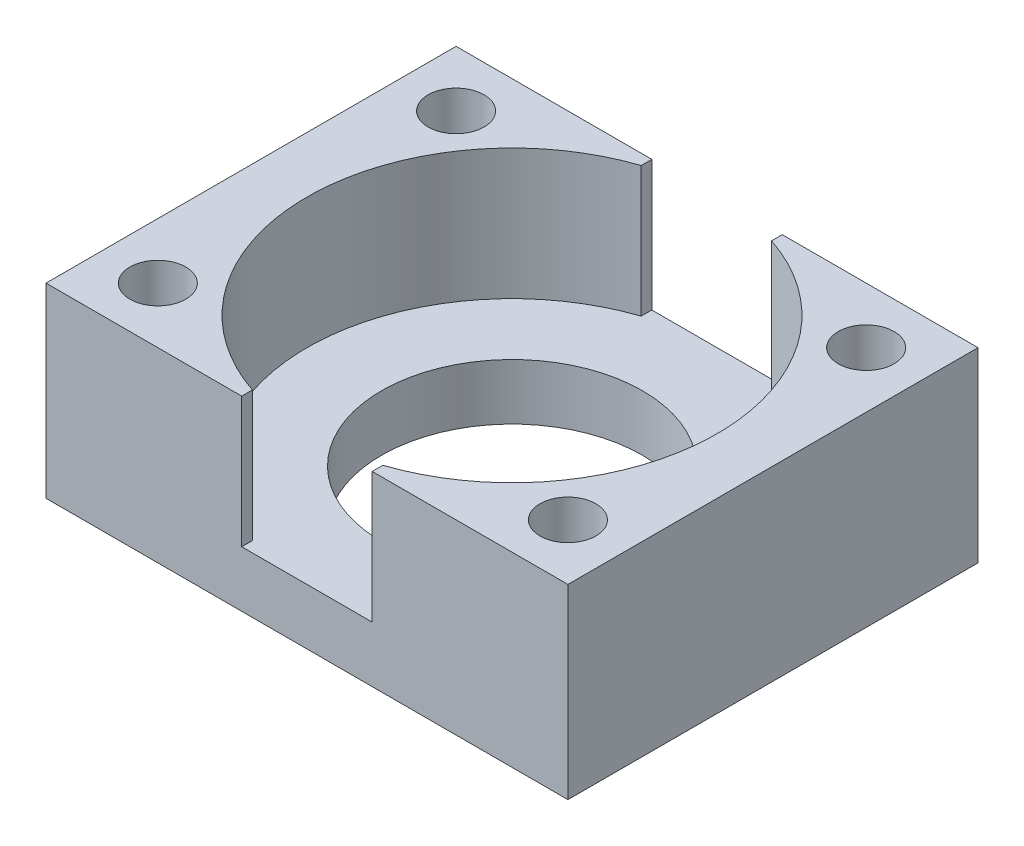
ISO-10303-21;
HEADER;
FILE_DESCRIPTION(('STEP AP214'),'2;1');
FILE_NAME('part.step','',(''),(''),'','','');
FILE_SCHEMA(('AUTOMOTIVE_DESIGN { 1 0 10303 214 1 1 1 1 }'));
ENDSEC;
DATA;
#1=APPLICATION_CONTEXT('core data for automotive mechanical design processes');
#2=APPLICATION_PROTOCOL_DEFINITION('international standard','automotive_design',2000,#1);
#3=PRODUCT_CONTEXT('',#1,'mechanical');
#4=PRODUCT('Part','Part','',(#3));
#5=PRODUCT_RELATED_PRODUCT_CATEGORY('part','',(#4));
#6=PRODUCT_DEFINITION_FORMATION('','',#4);
#7=PRODUCT_DEFINITION_CONTEXT('part definition',#1,'design');
#8=PRODUCT_DEFINITION('design','',#6,#7);
#9=PRODUCT_DEFINITION_SHAPE('','',#8);
#10=(LENGTH_UNIT() NAMED_UNIT(*) SI_UNIT(.MILLI.,.METRE.));
#11=(NAMED_UNIT(*) PLANE_ANGLE_UNIT() SI_UNIT($,.RADIAN.));
#12=(NAMED_UNIT(*) SI_UNIT($,.STERADIAN.) SOLID_ANGLE_UNIT());
#13=UNCERTAINTY_MEASURE_WITH_UNIT(LENGTH_MEASURE(1.E-05),#10,'distance_accuracy_value','');
#14=(GEOMETRIC_REPRESENTATION_CONTEXT(3) GLOBAL_UNCERTAINTY_ASSIGNED_CONTEXT((#13)) GLOBAL_UNIT_ASSIGNED_CONTEXT((#10,
#11,#12)) REPRESENTATION_CONTEXT('',''));
#15=CARTESIAN_POINT('',(0.,0.,0.));
#16=DIRECTION('',(0.,0.,1.));
#17=DIRECTION('',(1.,0.,0.));
#18=AXIS2_PLACEMENT_3D('',#15,#16,#17);
#19=CARTESIAN_POINT('',(-3.5,3.,11.));
#20=DIRECTION('',(-1.,0.,0.));
#21=DIRECTION('',(0.,-1.,0.));
#22=AXIS2_PLACEMENT_3D('',#19,#20,#21);
#23=PLANE('',#22);
#24=DIRECTION('',(0.,0.,-1.));
#25=VECTOR('',#24,1.);
#26=CARTESIAN_POINT('',(-3.5,3.,11.));
#27=LINE('',#26,#25);
#28=CARTESIAN_POINT('',(-3.5,3.,11.));
#29=VERTEX_POINT('',#28);
#30=CARTESIAN_POINT('',(-3.5,3.,10.4283268073071));
#31=VERTEX_POINT('',#30);
#32=EDGE_CURVE('E230',#29,#31,#27,.T.);
#33=ORIENTED_EDGE('',*,*,#32,.T.);
#34=DIRECTION('',(0.,1.,0.));
#35=VECTOR('',#34,1.);
#36=CARTESIAN_POINT('',(-3.5,3.,10.4283268073071));
#37=LINE('',#36,#35);
#38=CARTESIAN_POINT('',(-3.5,10.,10.4283268073071));
#39=VERTEX_POINT('',#38);
#40=EDGE_CURVE('E242',#31,#39,#37,.T.);
#41=ORIENTED_EDGE('',*,*,#40,.T.);
#42=DIRECTION('',(0.,0.,-1.));
#43=VECTOR('',#42,1.);
#44=CARTESIAN_POINT('',(-3.5,10.,11.));
#45=LINE('',#44,#43);
#46=CARTESIAN_POINT('',(-3.5,10.,11.));
#47=VERTEX_POINT('',#46);
#48=EDGE_CURVE('E173',#47,#39,#45,.T.);
#49=ORIENTED_EDGE('',*,*,#48,.F.);
#50=DIRECTION('',(0.,1.,0.));
#51=VECTOR('',#50,1.);
#52=CARTESIAN_POINT('',(-3.5,3.,11.));
#53=LINE('',#52,#51);
#54=EDGE_CURVE('E152',#29,#47,#53,.T.);
#55=ORIENTED_EDGE('',*,*,#54,.F.);
#56=EDGE_LOOP('',(#33,#41,#49,#55));
#57=FACE_BOUND('',#56,.T.);
#58=ADVANCED_FACE('F41',(#57),#23,.F.);
#59=CARTESIAN_POINT('',(3.5,3.,11.));
#60=DIRECTION('',(1.,0.,0.));
#61=DIRECTION('',(0.,1.,0.));
#62=AXIS2_PLACEMENT_3D('',#59,#60,#61);
#63=PLANE('',#62);
#64=DIRECTION('',(0.,0.,-1.));
#65=VECTOR('',#64,1.);
#66=CARTESIAN_POINT('',(3.5,3.,11.));
#67=LINE('',#66,#65);
#68=CARTESIAN_POINT('',(3.5,3.,-10.4283268073071));
#69=VERTEX_POINT('',#68);
#70=CARTESIAN_POINT('',(3.5,3.,-11.));
#71=VERTEX_POINT('',#70);
#72=EDGE_CURVE('E148',#69,#71,#67,.T.);
#73=ORIENTED_EDGE('',*,*,#72,.F.);
#74=DIRECTION('',(0.,1.,0.));
#75=VECTOR('',#74,1.);
#76=CARTESIAN_POINT('',(3.5,3.,-10.4283268073071));
#77=LINE('',#76,#75);
#78=CARTESIAN_POINT('',(3.5,10.,-10.4283268073071));
#79=VERTEX_POINT('',#78);
#80=EDGE_CURVE('E11',#69,#79,#77,.T.);
#81=ORIENTED_EDGE('',*,*,#80,.T.);
#82=DIRECTION('',(0.,0.,-1.));
#83=VECTOR('',#82,1.);
#84=CARTESIAN_POINT('',(3.5,10.,11.));
#85=LINE('',#84,#83);
#86=CARTESIAN_POINT('',(3.5,10.,-11.));
#87=VERTEX_POINT('',#86);
#88=EDGE_CURVE('E142',#79,#87,#85,.T.);
#89=ORIENTED_EDGE('',*,*,#88,.T.);
#90=DIRECTION('',(0.,-1.,0.));
#91=VECTOR('',#90,1.);
#92=CARTESIAN_POINT('',(3.5,3.,-11.));
#93=LINE('',#92,#91);
#94=EDGE_CURVE('E226',#87,#71,#93,.T.);
#95=ORIENTED_EDGE('',*,*,#94,.T.);
#96=EDGE_LOOP('',(#73,#81,#89,#95));
#97=FACE_BOUND('',#96,.T.);
#98=ADVANCED_FACE('F307',(#97),#63,.F.);
#99=CARTESIAN_POINT('',(0.,10.,0.));
#100=DIRECTION('',(0.,1.,0.));
#101=DIRECTION('',(0.,0.,1.));
#102=AXIS2_PLACEMENT_3D('',#99,#100,#101);
#103=PLANE('',#102);
#104=CARTESIAN_POINT('',(-11.,10.,-8.00000000000001));
#105=DIRECTION('',(0.,-1.,0.));
#106=DIRECTION('',(0.,0.,-1.));
#107=AXIS2_PLACEMENT_3D('',#104,#105,#106);
#108=CIRCLE('',#107,1.49999999999999);
#109=CARTESIAN_POINT('',(-11.,10.,-9.5));
#110=VERTEX_POINT('',#109);
#111=EDGE_CURVE('E262',#110,#110,#108,.T.);
#112=ORIENTED_EDGE('',*,*,#111,.T.);
#113=EDGE_LOOP('',(#112));
#114=FACE_BOUND('',#113,.T.);
#115=CARTESIAN_POINT('',(-11.,10.,7.99999999999999));
#116=DIRECTION('',(0.,-1.,0.));
#117=DIRECTION('',(0.,0.,1.));
#118=AXIS2_PLACEMENT_3D('',#115,#116,#117);
#119=CIRCLE('',#118,1.5);
#120=CARTESIAN_POINT('',(-11.,10.,9.49999999999999));
#121=VERTEX_POINT('',#120);
#122=EDGE_CURVE('E274',#121,#121,#119,.T.);
#123=ORIENTED_EDGE('',*,*,#122,.T.);
#124=EDGE_LOOP('',(#123));
#125=FACE_BOUND('',#124,.T.);
#126=CARTESIAN_POINT('',(0.,10.,0.));
#127=DIRECTION('',(0.,1.,0.));
#128=DIRECTION('',(0.,0.,1.));
#129=AXIS2_PLACEMENT_3D('',#126,#127,#128);
#130=CIRCLE('',#129,11.);
#131=CARTESIAN_POINT('',(-3.5,10.,-10.4283268073071));
#132=VERTEX_POINT('',#131);
#133=EDGE_CURVE('E143',#132,#39,#130,.T.);
#134=ORIENTED_EDGE('',*,*,#133,.F.);
#135=CARTESIAN_POINT('',(-3.5,10.,-11.));
#136=VERTEX_POINT('',#135);
#137=EDGE_CURVE('E215',#132,#136,#45,.T.);
#138=ORIENTED_EDGE('',*,*,#137,.T.);
#139=DIRECTION('',(-1.,0.,0.));
#140=VECTOR('',#139,1.);
#141=CARTESIAN_POINT('',(-14.,10.,-11.));
#142=LINE('',#141,#140);
#143=CARTESIAN_POINT('',(-14.,10.,-11.));
#144=VERTEX_POINT('',#143);
#145=EDGE_CURVE('E158',#136,#144,#142,.T.);
#146=ORIENTED_EDGE('',*,*,#145,.T.);
#147=DIRECTION('',(0.,0.,1.));
#148=VECTOR('',#147,1.);
#149=CARTESIAN_POINT('',(-14.,10.,-11.));
#150=LINE('',#149,#148);
#151=CARTESIAN_POINT('',(-14.,10.,11.));
#152=VERTEX_POINT('',#151);
#153=EDGE_CURVE('E162',#144,#152,#150,.T.);
#154=ORIENTED_EDGE('',*,*,#153,.T.);
#155=DIRECTION('',(1.,0.,0.));
#156=VECTOR('',#155,1.);
#157=CARTESIAN_POINT('',(-14.,10.,11.));
#158=LINE('',#157,#156);
#159=EDGE_CURVE('E165',#152,#47,#158,.T.);
#160=ORIENTED_EDGE('',*,*,#159,.T.);
#161=ORIENTED_EDGE('',*,*,#48,.T.);
#162=EDGE_LOOP('',(#134,#138,#146,#154,#160,#161));
#163=FACE_BOUND('',#162,.T.);
#164=ADVANCED_FACE('F213',(#114,#125,#163),#103,.T.);
#165=CARTESIAN_POINT('',(14.,10.,-11.));
#166=DIRECTION('',(-1.,0.,0.));
#167=DIRECTION('',(0.,0.,1.));
#168=AXIS2_PLACEMENT_3D('',#165,#166,#167);
#169=PLANE('',#168);
#170=DIRECTION('',(0.,0.,-1.));
#171=VECTOR('',#170,1.);
#172=CARTESIAN_POINT('',(14.,0.,-11.));
#173=LINE('',#172,#171);
#174=CARTESIAN_POINT('',(14.,0.,11.));
#175=VERTEX_POINT('',#174);
#176=CARTESIAN_POINT('',(14.,0.,-11.));
#177=VERTEX_POINT('',#176);
#178=EDGE_CURVE('E169',#175,#177,#173,.T.);
#179=ORIENTED_EDGE('',*,*,#178,.T.);
#180=DIRECTION('',(0.,-1.,0.));
#181=VECTOR('',#180,1.);
#182=CARTESIAN_POINT('',(14.,10.,-11.));
#183=LINE('',#182,#181);
#184=CARTESIAN_POINT('',(14.,10.,-11.));
#185=VERTEX_POINT('',#184);
#186=EDGE_CURVE('E134',#185,#177,#183,.T.);
#187=ORIENTED_EDGE('',*,*,#186,.F.);
#188=DIRECTION('',(0.,0.,-1.));
#189=VECTOR('',#188,1.);
#190=CARTESIAN_POINT('',(14.,10.,-11.));
#191=LINE('',#190,#189);
#192=CARTESIAN_POINT('',(14.,10.,11.));
#193=VERTEX_POINT('',#192);
#194=EDGE_CURVE('E155',#193,#185,#191,.T.);
#195=ORIENTED_EDGE('',*,*,#194,.F.);
#196=DIRECTION('',(0.,-1.,0.));
#197=VECTOR('',#196,1.);
#198=CARTESIAN_POINT('',(14.,10.,11.));
#199=LINE('',#198,#197);
#200=EDGE_CURVE('E168',#193,#175,#199,.T.);
#201=ORIENTED_EDGE('',*,*,#200,.T.);
#202=EDGE_LOOP('',(#179,#187,#195,#201));
#203=FACE_BOUND('',#202,.T.);
#204=ADVANCED_FACE('F43',(#203),#169,.F.);
#205=CARTESIAN_POINT('',(-14.,10.,-11.));
#206=DIRECTION('',(0.,0.,1.));
#207=DIRECTION('',(1.,0.,0.));
#208=AXIS2_PLACEMENT_3D('',#205,#206,#207);
#209=PLANE('',#208);
#210=ORIENTED_EDGE('',*,*,#145,.F.);
#211=DIRECTION('',(0.,1.,0.));
#212=VECTOR('',#211,1.);
#213=CARTESIAN_POINT('',(-3.5,3.,-11.));
#214=LINE('',#213,#212);
#215=CARTESIAN_POINT('',(-3.5,3.,-11.));
#216=VERTEX_POINT('',#215);
#217=EDGE_CURVE('E219',#216,#136,#214,.T.);
#218=ORIENTED_EDGE('',*,*,#217,.F.);
#219=DIRECTION('',(-1.,0.,0.));
#220=VECTOR('',#219,1.);
#221=CARTESIAN_POINT('',(3.5,3.,-11.));
#222=LINE('',#221,#220);
#223=EDGE_CURVE('E220',#71,#216,#222,.T.);
#224=ORIENTED_EDGE('',*,*,#223,.F.);
#225=ORIENTED_EDGE('',*,*,#94,.F.);
#226=EDGE_CURVE('E160',#185,#87,#142,.T.);
#227=ORIENTED_EDGE('',*,*,#226,.F.);
#228=ORIENTED_EDGE('',*,*,#186,.T.);
#229=DIRECTION('',(-1.,0.,0.));
#230=VECTOR('',#229,1.);
#231=CARTESIAN_POINT('',(-14.,0.,-11.));
#232=LINE('',#231,#230);
#233=CARTESIAN_POINT('',(-14.,0.,-11.));
#234=VERTEX_POINT('',#233);
#235=EDGE_CURVE('E172',#177,#234,#232,.T.);
#236=ORIENTED_EDGE('',*,*,#235,.T.);
#237=DIRECTION('',(0.,-1.,0.));
#238=VECTOR('',#237,1.);
#239=CARTESIAN_POINT('',(-14.,10.,-11.));
#240=LINE('',#239,#238);
#241=EDGE_CURVE('E183',#144,#234,#240,.T.);
#242=ORIENTED_EDGE('',*,*,#241,.F.);
#243=EDGE_LOOP('',(#210,#218,#224,#225,#227,#228,#236,#242));
#244=FACE_BOUND('',#243,.T.);
#245=ADVANCED_FACE('F190',(#244),#209,.F.);
#246=CARTESIAN_POINT('',(-14.,10.,-11.));
#247=DIRECTION('',(1.,0.,0.));
#248=DIRECTION('',(0.,0.,-1.));
#249=AXIS2_PLACEMENT_3D('',#246,#247,#248);
#250=PLANE('',#249);
#251=DIRECTION('',(0.,0.,1.));
#252=VECTOR('',#251,1.);
#253=CARTESIAN_POINT('',(-14.,0.,-11.));
#254=LINE('',#253,#252);
#255=CARTESIAN_POINT('',(-14.,0.,11.));
#256=VERTEX_POINT('',#255);
#257=EDGE_CURVE('E175',#234,#256,#254,.T.);
#258=ORIENTED_EDGE('',*,*,#257,.T.);
#259=DIRECTION('',(0.,-1.,0.));
#260=VECTOR('',#259,1.);
#261=CARTESIAN_POINT('',(-14.,10.,11.));
#262=LINE('',#261,#260);
#263=EDGE_CURVE('E180',#152,#256,#262,.T.);
#264=ORIENTED_EDGE('',*,*,#263,.F.);
#265=ORIENTED_EDGE('',*,*,#153,.F.);
#266=ORIENTED_EDGE('',*,*,#241,.T.);
#267=EDGE_LOOP('',(#258,#264,#265,#266));
#268=FACE_BOUND('',#267,.T.);
#269=ADVANCED_FACE('F203',(#268),#250,.F.);
#270=CARTESIAN_POINT('',(-14.,10.,11.));
#271=DIRECTION('',(0.,0.,-1.));
#272=DIRECTION('',(-1.,0.,0.));
#273=AXIS2_PLACEMENT_3D('',#270,#271,#272);
#274=PLANE('',#273);
#275=DIRECTION('',(-1.,0.,0.));
#276=VECTOR('',#275,1.);
#277=CARTESIAN_POINT('',(3.5,3.,11.));
#278=LINE('',#277,#276);
#279=CARTESIAN_POINT('',(3.5,3.,11.));
#280=VERTEX_POINT('',#279);
#281=EDGE_CURVE('E224',#280,#29,#278,.T.);
#282=ORIENTED_EDGE('',*,*,#281,.T.);
#283=ORIENTED_EDGE('',*,*,#54,.T.);
#284=ORIENTED_EDGE('',*,*,#159,.F.);
#285=ORIENTED_EDGE('',*,*,#263,.T.);
#286=DIRECTION('',(1.,0.,0.));
#287=VECTOR('',#286,1.);
#288=CARTESIAN_POINT('',(-14.,0.,11.));
#289=LINE('',#288,#287);
#290=EDGE_CURVE('E159',#256,#175,#289,.T.);
#291=ORIENTED_EDGE('',*,*,#290,.T.);
#292=ORIENTED_EDGE('',*,*,#200,.F.);
#293=CARTESIAN_POINT('',(3.5,10.,11.));
#294=VERTEX_POINT('',#293);
#295=EDGE_CURVE('E164',#294,#193,#158,.T.);
#296=ORIENTED_EDGE('',*,*,#295,.F.);
#297=DIRECTION('',(0.,-1.,0.));
#298=VECTOR('',#297,1.);
#299=CARTESIAN_POINT('',(3.5,3.,11.));
#300=LINE('',#299,#298);
#301=EDGE_CURVE('E147',#294,#280,#300,.T.);
#302=ORIENTED_EDGE('',*,*,#301,.T.);
#303=EDGE_LOOP('',(#282,#283,#284,#285,#291,#292,#296,#302));
#304=FACE_BOUND('',#303,.T.);
#305=ADVANCED_FACE('F207',(#304),#274,.F.);
#306=CARTESIAN_POINT('',(11.,10.,8.));
#307=DIRECTION('',(0.,-1.,0.));
#308=DIRECTION('',(0.,0.,-1.));
#309=AXIS2_PLACEMENT_3D('',#306,#307,#308);
#310=CIRCLE('',#309,1.5);
#311=CARTESIAN_POINT('',(11.,10.,6.5));
#312=VERTEX_POINT('',#311);
#313=EDGE_CURVE('E269',#312,#312,#310,.T.);
#314=ORIENTED_EDGE('',*,*,#313,.T.);
#315=EDGE_LOOP('',(#314));
#316=FACE_BOUND('',#315,.T.);
#317=CARTESIAN_POINT('',(11.,10.,-8.));
#318=DIRECTION('',(0.,-1.,0.));
#319=DIRECTION('',(0.,0.,1.));
#320=AXIS2_PLACEMENT_3D('',#317,#318,#319);
#321=CIRCLE('',#320,1.5);
#322=CARTESIAN_POINT('',(11.,10.,-6.5));
#323=VERTEX_POINT('',#322);
#324=EDGE_CURVE('E253',#323,#323,#321,.T.);
#325=ORIENTED_EDGE('',*,*,#324,.T.);
#326=EDGE_LOOP('',(#325));
#327=FACE_BOUND('',#326,.T.);
#328=CARTESIAN_POINT('',(3.5,10.,10.4283268073071));
#329=VERTEX_POINT('',#328);
#330=EDGE_CURVE('E131',#329,#79,#130,.T.);
#331=ORIENTED_EDGE('',*,*,#330,.F.);
#332=EDGE_CURVE('E139',#294,#329,#85,.T.);
#333=ORIENTED_EDGE('',*,*,#332,.F.);
#334=ORIENTED_EDGE('',*,*,#295,.T.);
#335=ORIENTED_EDGE('',*,*,#194,.T.);
#336=ORIENTED_EDGE('',*,*,#226,.T.);
#337=ORIENTED_EDGE('',*,*,#88,.F.);
#338=EDGE_LOOP('',(#331,#333,#334,#335,#336,#337));
#339=FACE_BOUND('',#338,.T.);
#340=ADVANCED_FACE('F138',(#316,#327,#339),#103,.T.);
#341=CARTESIAN_POINT('',(0.,0.,0.));
#342=DIRECTION('',(0.,1.,0.));
#343=DIRECTION('',(0.,0.,1.));
#344=AXIS2_PLACEMENT_3D('',#341,#342,#343);
#345=PLANE('',#344);
#346=CARTESIAN_POINT('',(11.,0.,8.));
#347=DIRECTION('',(0.,-1.,0.));
#348=DIRECTION('',(0.,0.,-1.));
#349=AXIS2_PLACEMENT_3D('',#346,#347,#348);
#350=CIRCLE('',#349,1.5);
#351=CARTESIAN_POINT('',(11.,0.,6.5));
#352=VERTEX_POINT('',#351);
#353=EDGE_CURVE('E259',#352,#352,#350,.T.);
#354=ORIENTED_EDGE('',*,*,#353,.F.);
#355=EDGE_LOOP('',(#354));
#356=FACE_BOUND('',#355,.T.);
#357=CARTESIAN_POINT('',(-11.,0.,-8.00000000000001));
#358=DIRECTION('',(0.,-1.,0.));
#359=DIRECTION('',(0.,0.,-1.));
#360=AXIS2_PLACEMENT_3D('',#357,#358,#359);
#361=CIRCLE('',#360,1.49999999999999);
#362=CARTESIAN_POINT('',(-11.,0.,-9.5));
#363=VERTEX_POINT('',#362);
#364=EDGE_CURVE('E265',#363,#363,#361,.T.);
#365=ORIENTED_EDGE('',*,*,#364,.F.);
#366=EDGE_LOOP('',(#365));
#367=FACE_BOUND('',#366,.T.);
#368=CARTESIAN_POINT('',(-11.,0.,7.99999999999999));
#369=DIRECTION('',(0.,-1.,0.));
#370=DIRECTION('',(0.,0.,1.));
#371=AXIS2_PLACEMENT_3D('',#368,#369,#370);
#372=CIRCLE('',#371,1.5);
#373=CARTESIAN_POINT('',(-11.,0.,9.49999999999999));
#374=VERTEX_POINT('',#373);
#375=EDGE_CURVE('E266',#374,#374,#372,.T.);
#376=ORIENTED_EDGE('',*,*,#375,.F.);
#377=EDGE_LOOP('',(#376));
#378=FACE_BOUND('',#377,.T.);
#379=CARTESIAN_POINT('',(11.,0.,-8.));
#380=DIRECTION('',(0.,-1.,0.));
#381=DIRECTION('',(0.,0.,1.));
#382=AXIS2_PLACEMENT_3D('',#379,#380,#381);
#383=CIRCLE('',#382,1.5);
#384=CARTESIAN_POINT('',(11.,0.,-6.5));
#385=VERTEX_POINT('',#384);
#386=EDGE_CURVE('E256',#385,#385,#383,.T.);
#387=ORIENTED_EDGE('',*,*,#386,.F.);
#388=EDGE_LOOP('',(#387));
#389=FACE_BOUND('',#388,.T.);
#390=CARTESIAN_POINT('',(0.,0.,0.));
#391=DIRECTION('',(0.,-1.,0.));
#392=DIRECTION('',(0.,0.,-1.));
#393=AXIS2_PLACEMENT_3D('',#390,#391,#392);
#394=CIRCLE('',#393,7.);
#395=CARTESIAN_POINT('',(0.,0.,-7.));
#396=VERTEX_POINT('',#395);
#397=EDGE_CURVE('E249',#396,#396,#394,.T.);
#398=ORIENTED_EDGE('',*,*,#397,.F.);
#399=EDGE_LOOP('',(#398));
#400=FACE_BOUND('',#399,.T.);
#401=ORIENTED_EDGE('',*,*,#178,.F.);
#402=ORIENTED_EDGE('',*,*,#290,.F.);
#403=ORIENTED_EDGE('',*,*,#257,.F.);
#404=ORIENTED_EDGE('',*,*,#235,.F.);
#405=EDGE_LOOP('',(#401,#402,#403,#404));
#406=FACE_BOUND('',#405,.T.);
#407=ADVANCED_FACE('F199',(#356,#367,#378,#389,#400,#406),#345,.F.);
#408=ORIENTED_EDGE('',*,*,#137,.F.);
#409=DIRECTION('',(0.,1.,0.));
#410=VECTOR('',#409,1.);
#411=CARTESIAN_POINT('',(-3.5,3.,-10.4283268073071));
#412=LINE('',#411,#410);
#413=CARTESIAN_POINT('',(-3.5,3.,-10.4283268073071));
#414=VERTEX_POINT('',#413);
#415=EDGE_CURVE('E245',#132,#414,#412,.F.);
#416=ORIENTED_EDGE('',*,*,#415,.T.);
#417=EDGE_CURVE('E232',#414,#216,#27,.T.);
#418=ORIENTED_EDGE('',*,*,#417,.T.);
#419=ORIENTED_EDGE('',*,*,#217,.T.);
#420=EDGE_LOOP('',(#408,#416,#418,#419));
#421=FACE_BOUND('',#420,.T.);
#422=ADVANCED_FACE('F284',(#421),#23,.F.);
#423=CARTESIAN_POINT('',(3.5,3.,11.));
#424=DIRECTION('',(0.,-1.,0.));
#425=DIRECTION('',(0.,0.,-1.));
#426=AXIS2_PLACEMENT_3D('',#423,#424,#425);
#427=PLANE('',#426);
#428=CARTESIAN_POINT('',(0.,3.,0.));
#429=DIRECTION('',(0.,-1.,0.));
#430=DIRECTION('',(0.,0.,-1.));
#431=AXIS2_PLACEMENT_3D('',#428,#429,#430);
#432=CIRCLE('',#431,7.);
#433=CARTESIAN_POINT('',(0.,3.,-7.));
#434=VERTEX_POINT('',#433);
#435=EDGE_CURVE('E252',#434,#434,#432,.T.);
#436=ORIENTED_EDGE('',*,*,#435,.T.);
#437=EDGE_LOOP('',(#436));
#438=FACE_BOUND('',#437,.T.);
#439=ORIENTED_EDGE('',*,*,#417,.F.);
#440=CARTESIAN_POINT('',(0.,3.,0.));
#441=DIRECTION('',(0.,1.,0.));
#442=DIRECTION('',(0.,0.,1.));
#443=AXIS2_PLACEMENT_3D('',#440,#441,#442);
#444=CIRCLE('',#443,11.);
#445=EDGE_CURVE('E56',#414,#31,#444,.T.);
#446=ORIENTED_EDGE('',*,*,#445,.T.);
#447=ORIENTED_EDGE('',*,*,#32,.F.);
#448=ORIENTED_EDGE('',*,*,#281,.F.);
#449=CARTESIAN_POINT('',(3.5,3.,10.4283268073071));
#450=VERTEX_POINT('',#449);
#451=EDGE_CURVE('E150',#280,#450,#67,.T.);
#452=ORIENTED_EDGE('',*,*,#451,.T.);
#453=EDGE_CURVE('E63',#450,#69,#444,.T.);
#454=ORIENTED_EDGE('',*,*,#453,.T.);
#455=ORIENTED_EDGE('',*,*,#72,.T.);
#456=ORIENTED_EDGE('',*,*,#223,.T.);
#457=EDGE_LOOP('',(#439,#446,#447,#448,#452,#454,#455,#456));
#458=FACE_BOUND('',#457,.T.);
#459=ADVANCED_FACE('F237',(#438,#458),#427,.F.);
#460=ORIENTED_EDGE('',*,*,#332,.T.);
#461=DIRECTION('',(0.,1.,0.));
#462=VECTOR('',#461,1.);
#463=CARTESIAN_POINT('',(3.5,3.,10.4283268073071));
#464=LINE('',#463,#462);
#465=EDGE_CURVE('E49',#329,#450,#464,.F.);
#466=ORIENTED_EDGE('',*,*,#465,.T.);
#467=ORIENTED_EDGE('',*,*,#451,.F.);
#468=ORIENTED_EDGE('',*,*,#301,.F.);
#469=EDGE_LOOP('',(#460,#466,#467,#468));
#470=FACE_BOUND('',#469,.T.);
#471=ADVANCED_FACE('F145',(#470),#63,.F.);
#472=CARTESIAN_POINT('',(0.,3.,0.));
#473=DIRECTION('',(0.,1.,0.));
#474=DIRECTION('',(0.,0.,1.));
#475=AXIS2_PLACEMENT_3D('',#472,#473,#474);
#476=CYLINDRICAL_SURFACE('',#475,11.);
#477=ORIENTED_EDGE('',*,*,#453,.F.);
#478=ORIENTED_EDGE('',*,*,#465,.F.);
#479=ORIENTED_EDGE('',*,*,#330,.T.);
#480=ORIENTED_EDGE('',*,*,#80,.F.);
#481=EDGE_LOOP('',(#477,#478,#479,#480));
#482=FACE_BOUND('',#481,.T.);
#483=ADVANCED_FACE('F130',(#482),#476,.F.);
#484=ORIENTED_EDGE('',*,*,#445,.F.);
#485=ORIENTED_EDGE('',*,*,#415,.F.);
#486=ORIENTED_EDGE('',*,*,#133,.T.);
#487=ORIENTED_EDGE('',*,*,#40,.F.);
#488=EDGE_LOOP('',(#484,#485,#486,#487));
#489=FACE_BOUND('',#488,.T.);
#490=ADVANCED_FACE('F294',(#489),#476,.F.);
#491=CARTESIAN_POINT('',(0.,3.,0.));
#492=DIRECTION('',(0.,-1.,0.));
#493=DIRECTION('',(0.,0.,-1.));
#494=AXIS2_PLACEMENT_3D('',#491,#492,#493);
#495=CYLINDRICAL_SURFACE('',#494,7.);
#496=ORIENTED_EDGE('',*,*,#435,.F.);
#497=EDGE_LOOP('',(#496));
#498=FACE_BOUND('',#497,.T.);
#499=ORIENTED_EDGE('',*,*,#397,.T.);
#500=EDGE_LOOP('',(#499));
#501=FACE_BOUND('',#500,.T.);
#502=ADVANCED_FACE('F291',(#498,#501),#495,.F.);
#503=CARTESIAN_POINT('',(11.,10.,-8.));
#504=DIRECTION('',(0.,-1.,0.));
#505=DIRECTION('',(0.,0.,-1.));
#506=AXIS2_PLACEMENT_3D('',#503,#504,#505);
#507=CYLINDRICAL_SURFACE('',#506,1.5);
#508=ORIENTED_EDGE('',*,*,#324,.F.);
#509=EDGE_LOOP('',(#508));
#510=FACE_BOUND('',#509,.T.);
#511=ORIENTED_EDGE('',*,*,#386,.T.);
#512=EDGE_LOOP('',(#511));
#513=FACE_BOUND('',#512,.T.);
#514=ADVANCED_FACE('F293',(#510,#513),#507,.F.);
#515=CARTESIAN_POINT('',(-11.,10.,7.99999999999999));
#516=DIRECTION('',(0.,-1.,0.));
#517=DIRECTION('',(0.,0.,-1.));
#518=AXIS2_PLACEMENT_3D('',#515,#516,#517);
#519=CYLINDRICAL_SURFACE('',#518,1.5);
#520=ORIENTED_EDGE('',*,*,#122,.F.);
#521=EDGE_LOOP('',(#520));
#522=FACE_BOUND('',#521,.T.);
#523=ORIENTED_EDGE('',*,*,#375,.T.);
#524=EDGE_LOOP('',(#523));
#525=FACE_BOUND('',#524,.T.);
#526=ADVANCED_FACE('F280',(#522,#525),#519,.F.);
#527=CARTESIAN_POINT('',(-11.,10.,-8.00000000000001));
#528=DIRECTION('',(0.,-1.,0.));
#529=DIRECTION('',(0.,0.,-1.));
#530=AXIS2_PLACEMENT_3D('',#527,#528,#529);
#531=CYLINDRICAL_SURFACE('',#530,1.49999999999999);
#532=ORIENTED_EDGE('',*,*,#111,.F.);
#533=EDGE_LOOP('',(#532));
#534=FACE_BOUND('',#533,.T.);
#535=ORIENTED_EDGE('',*,*,#364,.T.);
#536=EDGE_LOOP('',(#535));
#537=FACE_BOUND('',#536,.T.);
#538=ADVANCED_FACE('F344',(#534,#537),#531,.F.);
#539=CARTESIAN_POINT('',(11.,10.,8.));
#540=DIRECTION('',(0.,-1.,0.));
#541=DIRECTION('',(0.,0.,-1.));
#542=AXIS2_PLACEMENT_3D('',#539,#540,#541);
#543=CYLINDRICAL_SURFACE('',#542,1.5);
#544=ORIENTED_EDGE('',*,*,#313,.F.);
#545=EDGE_LOOP('',(#544));
#546=FACE_BOUND('',#545,.T.);
#547=ORIENTED_EDGE('',*,*,#353,.T.);
#548=EDGE_LOOP('',(#547));
#549=FACE_BOUND('',#548,.T.);
#550=ADVANCED_FACE('F349',(#546,#549),#543,.F.);
#551=CLOSED_SHELL('',(#58,#98,#164,#204,#245,#269,#305,#340,#407,#422,#459,#471,#483,#490,#502,
#514,#526,#538,#550));
#552=MANIFOLD_SOLID_BREP('B2',#551);
#553=ADVANCED_BREP_SHAPE_REPRESENTATION('',(#18,#552),#14);
#554=SHAPE_DEFINITION_REPRESENTATION(#9,#553);
ENDSEC;
END-ISO-10303-21;
